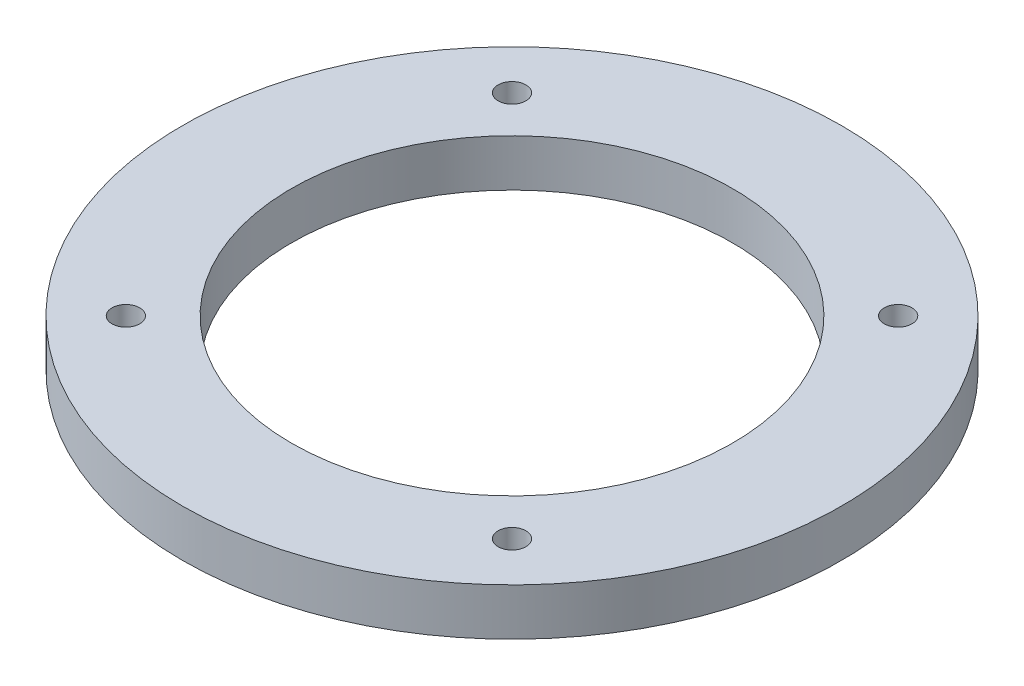
ISO-10303-21;
HEADER;
FILE_DESCRIPTION(('STEP AP214'),'2;1');
FILE_NAME('part.step','',(''),(''),'','','');
FILE_SCHEMA(('AUTOMOTIVE_DESIGN { 1 0 10303 214 1 1 1 1 }'));
ENDSEC;
DATA;
#1=APPLICATION_CONTEXT('core data for automotive mechanical design processes');
#2=APPLICATION_PROTOCOL_DEFINITION('international standard','automotive_design',2000,#1);
#3=PRODUCT_CONTEXT('',#1,'mechanical');
#4=PRODUCT('Part','Part','',(#3));
#5=PRODUCT_RELATED_PRODUCT_CATEGORY('part','',(#4));
#6=PRODUCT_DEFINITION_FORMATION('','',#4);
#7=PRODUCT_DEFINITION_CONTEXT('part definition',#1,'design');
#8=PRODUCT_DEFINITION('design','',#6,#7);
#9=PRODUCT_DEFINITION_SHAPE('','',#8);
#10=(LENGTH_UNIT() NAMED_UNIT(*) SI_UNIT(.MILLI.,.METRE.));
#11=(NAMED_UNIT(*) PLANE_ANGLE_UNIT() SI_UNIT($,.RADIAN.));
#12=(NAMED_UNIT(*) SI_UNIT($,.STERADIAN.) SOLID_ANGLE_UNIT());
#13=UNCERTAINTY_MEASURE_WITH_UNIT(LENGTH_MEASURE(1.E-05),#10,'distance_accuracy_value','');
#14=(GEOMETRIC_REPRESENTATION_CONTEXT(3) GLOBAL_UNCERTAINTY_ASSIGNED_CONTEXT((#13)) GLOBAL_UNIT_ASSIGNED_CONTEXT((#10,
#11,#12)) REPRESENTATION_CONTEXT('',''));
#15=CARTESIAN_POINT('',(0.,0.,0.));
#16=DIRECTION('',(0.,0.,1.));
#17=DIRECTION('',(1.,0.,0.));
#18=AXIS2_PLACEMENT_3D('',#15,#16,#17);
#19=CARTESIAN_POINT('',(0.,2.5,0.));
#20=DIRECTION('',(0.,1.,0.));
#21=DIRECTION('',(0.,0.,1.));
#22=AXIS2_PLACEMENT_3D('',#19,#20,#21);
#23=PLANE('',#22);
#24=CARTESIAN_POINT('',(20.505,2.5,20.505));
#25=DIRECTION('',(0.,1.,0.));
#26=DIRECTION('',(0.,0.,1.));
#27=AXIS2_PLACEMENT_3D('',#24,#25,#26);
#28=CIRCLE('',#27,1.475);
#29=CARTESIAN_POINT('',(20.505,2.5,21.98));
#30=VERTEX_POINT('',#29);
#31=EDGE_CURVE('E64',#30,#30,#28,.T.);
#32=ORIENTED_EDGE('',*,*,#31,.F.);
#33=EDGE_LOOP('',(#32));
#34=FACE_BOUND('',#33,.T.);
#35=CARTESIAN_POINT('',(-20.505,2.5,-20.505));
#36=DIRECTION('',(0.,1.,0.));
#37=DIRECTION('',(0.,0.,1.));
#38=AXIS2_PLACEMENT_3D('',#35,#36,#37);
#39=CIRCLE('',#38,1.475);
#40=CARTESIAN_POINT('',(-20.505,2.5,-19.03));
#41=VERTEX_POINT('',#40);
#42=EDGE_CURVE('E52',#41,#41,#39,.T.);
#43=ORIENTED_EDGE('',*,*,#42,.F.);
#44=EDGE_LOOP('',(#43));
#45=FACE_BOUND('',#44,.T.);
#46=CARTESIAN_POINT('',(0.,2.5,0.));
#47=DIRECTION('',(0.,1.,0.));
#48=DIRECTION('',(0.,0.,1.));
#49=AXIS2_PLACEMENT_3D('',#46,#47,#48);
#50=CIRCLE('',#49,35.);
#51=CARTESIAN_POINT('',(0.,2.5,35.));
#52=VERTEX_POINT('',#51);
#53=EDGE_CURVE('E10',#52,#52,#50,.T.);
#54=ORIENTED_EDGE('',*,*,#53,.T.);
#55=EDGE_LOOP('',(#54));
#56=FACE_BOUND('',#55,.T.);
#57=CARTESIAN_POINT('',(0.,2.5,0.));
#58=DIRECTION('',(0.,1.,0.));
#59=DIRECTION('',(0.,0.,1.));
#60=AXIS2_PLACEMENT_3D('',#57,#58,#59);
#61=CIRCLE('',#60,23.425);
#62=CARTESIAN_POINT('',(0.,2.5,23.425));
#63=VERTEX_POINT('',#62);
#64=EDGE_CURVE('E47',#63,#63,#61,.T.);
#65=ORIENTED_EDGE('',*,*,#64,.F.);
#66=EDGE_LOOP('',(#65));
#67=FACE_BOUND('',#66,.T.);
#68=CARTESIAN_POINT('',(20.505,2.5,-20.505));
#69=DIRECTION('',(0.,1.,0.));
#70=DIRECTION('',(0.,0.,-1.));
#71=AXIS2_PLACEMENT_3D('',#68,#69,#70);
#72=CIRCLE('',#71,1.475);
#73=CARTESIAN_POINT('',(20.505,2.5,-21.98));
#74=VERTEX_POINT('',#73);
#75=EDGE_CURVE('E58',#74,#74,#72,.T.);
#76=ORIENTED_EDGE('',*,*,#75,.F.);
#77=EDGE_LOOP('',(#76));
#78=FACE_BOUND('',#77,.T.);
#79=CARTESIAN_POINT('',(-20.505,2.5,20.505));
#80=DIRECTION('',(0.,1.,0.));
#81=DIRECTION('',(0.,0.,-1.));
#82=AXIS2_PLACEMENT_3D('',#79,#80,#81);
#83=CIRCLE('',#82,1.475);
#84=CARTESIAN_POINT('',(-20.505,2.5,19.03));
#85=VERTEX_POINT('',#84);
#86=EDGE_CURVE('E70',#85,#85,#83,.T.);
#87=ORIENTED_EDGE('',*,*,#86,.F.);
#88=EDGE_LOOP('',(#87));
#89=FACE_BOUND('',#88,.T.);
#90=ADVANCED_FACE('F36',(#34,#45,#56,#67,#78,#89),#23,.T.);
#91=CARTESIAN_POINT('',(0.,-2.5,0.));
#92=DIRECTION('',(0.,1.,0.));
#93=DIRECTION('',(0.,0.,1.));
#94=AXIS2_PLACEMENT_3D('',#91,#92,#93);
#95=PLANE('',#94);
#96=CARTESIAN_POINT('',(0.,-2.5,0.));
#97=DIRECTION('',(0.,1.,0.));
#98=DIRECTION('',(0.,0.,1.));
#99=AXIS2_PLACEMENT_3D('',#96,#97,#98);
#100=CIRCLE('',#99,35.);
#101=CARTESIAN_POINT('',(0.,-2.5,35.));
#102=VERTEX_POINT('',#101);
#103=EDGE_CURVE('E40',#102,#102,#100,.T.);
#104=ORIENTED_EDGE('',*,*,#103,.F.);
#105=EDGE_LOOP('',(#104));
#106=FACE_BOUND('',#105,.T.);
#107=CARTESIAN_POINT('',(0.,-2.5,0.));
#108=DIRECTION('',(0.,1.,0.));
#109=DIRECTION('',(0.,0.,1.));
#110=AXIS2_PLACEMENT_3D('',#107,#108,#109);
#111=CIRCLE('',#110,23.425);
#112=CARTESIAN_POINT('',(0.,-2.5,23.425));
#113=VERTEX_POINT('',#112);
#114=EDGE_CURVE('E49',#113,#113,#111,.T.);
#115=ORIENTED_EDGE('',*,*,#114,.T.);
#116=EDGE_LOOP('',(#115));
#117=FACE_BOUND('',#116,.T.);
#118=CARTESIAN_POINT('',(-20.505,-2.5,-20.505));
#119=DIRECTION('',(0.,1.,0.));
#120=DIRECTION('',(0.,0.,1.));
#121=AXIS2_PLACEMENT_3D('',#118,#119,#120);
#122=CIRCLE('',#121,1.475);
#123=CARTESIAN_POINT('',(-20.505,-2.5,-19.03));
#124=VERTEX_POINT('',#123);
#125=EDGE_CURVE('E55',#124,#124,#122,.T.);
#126=ORIENTED_EDGE('',*,*,#125,.T.);
#127=EDGE_LOOP('',(#126));
#128=FACE_BOUND('',#127,.T.);
#129=CARTESIAN_POINT('',(20.505,-2.5,-20.505));
#130=DIRECTION('',(0.,1.,0.));
#131=DIRECTION('',(0.,0.,-1.));
#132=AXIS2_PLACEMENT_3D('',#129,#130,#131);
#133=CIRCLE('',#132,1.475);
#134=CARTESIAN_POINT('',(20.505,-2.5,-21.98));
#135=VERTEX_POINT('',#134);
#136=EDGE_CURVE('E61',#135,#135,#133,.T.);
#137=ORIENTED_EDGE('',*,*,#136,.T.);
#138=EDGE_LOOP('',(#137));
#139=FACE_BOUND('',#138,.T.);
#140=CARTESIAN_POINT('',(20.505,-2.5,20.505));
#141=DIRECTION('',(0.,1.,0.));
#142=DIRECTION('',(0.,0.,1.));
#143=AXIS2_PLACEMENT_3D('',#140,#141,#142);
#144=CIRCLE('',#143,1.475);
#145=CARTESIAN_POINT('',(20.505,-2.5,21.98));
#146=VERTEX_POINT('',#145);
#147=EDGE_CURVE('E67',#146,#146,#144,.T.);
#148=ORIENTED_EDGE('',*,*,#147,.T.);
#149=EDGE_LOOP('',(#148));
#150=FACE_BOUND('',#149,.T.);
#151=CARTESIAN_POINT('',(-20.505,-2.5,20.505));
#152=DIRECTION('',(0.,1.,0.));
#153=DIRECTION('',(0.,0.,-1.));
#154=AXIS2_PLACEMENT_3D('',#151,#152,#153);
#155=CIRCLE('',#154,1.475);
#156=CARTESIAN_POINT('',(-20.505,-2.5,19.03));
#157=VERTEX_POINT('',#156);
#158=EDGE_CURVE('E73',#157,#157,#155,.T.);
#159=ORIENTED_EDGE('',*,*,#158,.T.);
#160=EDGE_LOOP('',(#159));
#161=FACE_BOUND('',#160,.T.);
#162=ADVANCED_FACE('F83',(#106,#117,#128,#139,#150,#161),#95,.F.);
#163=CARTESIAN_POINT('',(0.,2.5,0.));
#164=DIRECTION('',(0.,-1.,0.));
#165=DIRECTION('',(0.,0.,-1.));
#166=AXIS2_PLACEMENT_3D('',#163,#164,#165);
#167=CYLINDRICAL_SURFACE('',#166,35.);
#168=ORIENTED_EDGE('',*,*,#53,.F.);
#169=EDGE_LOOP('',(#168));
#170=FACE_BOUND('',#169,.T.);
#171=ORIENTED_EDGE('',*,*,#103,.T.);
#172=EDGE_LOOP('',(#171));
#173=FACE_BOUND('',#172,.T.);
#174=ADVANCED_FACE('F38',(#170,#173),#167,.T.);
#175=CARTESIAN_POINT('',(0.,2.5,0.));
#176=DIRECTION('',(0.,-1.,0.));
#177=DIRECTION('',(0.,0.,-1.));
#178=AXIS2_PLACEMENT_3D('',#175,#176,#177);
#179=CYLINDRICAL_SURFACE('',#178,23.425);
#180=ORIENTED_EDGE('',*,*,#64,.T.);
#181=EDGE_LOOP('',(#180));
#182=FACE_BOUND('',#181,.T.);
#183=ORIENTED_EDGE('',*,*,#114,.F.);
#184=EDGE_LOOP('',(#183));
#185=FACE_BOUND('',#184,.T.);
#186=ADVANCED_FACE('F93',(#182,#185),#179,.F.);
#187=CARTESIAN_POINT('',(-20.505,2.5,-20.505));
#188=DIRECTION('',(0.,-1.,0.));
#189=DIRECTION('',(0.,0.,-1.));
#190=AXIS2_PLACEMENT_3D('',#187,#188,#189);
#191=CYLINDRICAL_SURFACE('',#190,1.475);
#192=ORIENTED_EDGE('',*,*,#42,.T.);
#193=EDGE_LOOP('',(#192));
#194=FACE_BOUND('',#193,.T.);
#195=ORIENTED_EDGE('',*,*,#125,.F.);
#196=EDGE_LOOP('',(#195));
#197=FACE_BOUND('',#196,.T.);
#198=ADVANCED_FACE('F96',(#194,#197),#191,.F.);
#199=CARTESIAN_POINT('',(20.505,2.5,-20.505));
#200=DIRECTION('',(0.,-1.,0.));
#201=DIRECTION('',(0.,0.,-1.));
#202=AXIS2_PLACEMENT_3D('',#199,#200,#201);
#203=CYLINDRICAL_SURFACE('',#202,1.475);
#204=ORIENTED_EDGE('',*,*,#75,.T.);
#205=EDGE_LOOP('',(#204));
#206=FACE_BOUND('',#205,.T.);
#207=ORIENTED_EDGE('',*,*,#136,.F.);
#208=EDGE_LOOP('',(#207));
#209=FACE_BOUND('',#208,.T.);
#210=ADVANCED_FACE('F100',(#206,#209),#203,.F.);
#211=CARTESIAN_POINT('',(20.505,2.5,20.505));
#212=DIRECTION('',(0.,-1.,0.));
#213=DIRECTION('',(0.,0.,-1.));
#214=AXIS2_PLACEMENT_3D('',#211,#212,#213);
#215=CYLINDRICAL_SURFACE('',#214,1.475);
#216=ORIENTED_EDGE('',*,*,#31,.T.);
#217=EDGE_LOOP('',(#216));
#218=FACE_BOUND('',#217,.T.);
#219=ORIENTED_EDGE('',*,*,#147,.F.);
#220=EDGE_LOOP('',(#219));
#221=FACE_BOUND('',#220,.T.);
#222=ADVANCED_FACE('F104',(#218,#221),#215,.F.);
#223=CARTESIAN_POINT('',(-20.505,2.5,20.505));
#224=DIRECTION('',(0.,-1.,0.));
#225=DIRECTION('',(0.,0.,-1.));
#226=AXIS2_PLACEMENT_3D('',#223,#224,#225);
#227=CYLINDRICAL_SURFACE('',#226,1.475);
#228=ORIENTED_EDGE('',*,*,#86,.T.);
#229=EDGE_LOOP('',(#228));
#230=FACE_BOUND('',#229,.T.);
#231=ORIENTED_EDGE('',*,*,#158,.F.);
#232=EDGE_LOOP('',(#231));
#233=FACE_BOUND('',#232,.T.);
#234=ADVANCED_FACE('F79',(#230,#233),#227,.F.);
#235=CLOSED_SHELL('',(#90,#162,#174,#186,#198,#210,#222,#234));
#236=MANIFOLD_SOLID_BREP('B2',#235);
#237=ADVANCED_BREP_SHAPE_REPRESENTATION('',(#18,#236),#14);
#238=SHAPE_DEFINITION_REPRESENTATION(#9,#237);
ENDSEC;
END-ISO-10303-21;
